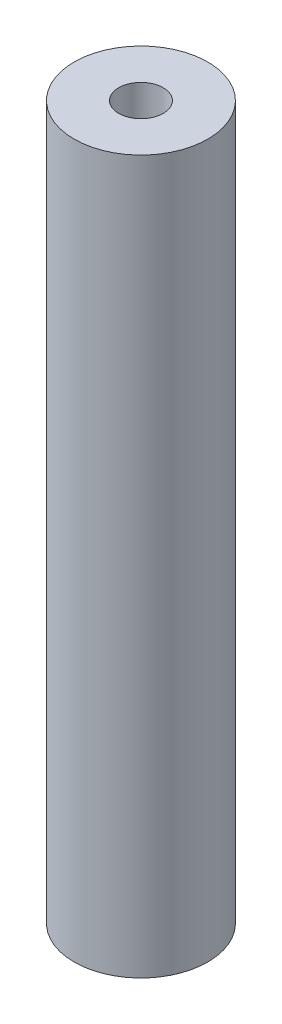
ISO-10303-21;
HEADER;
FILE_DESCRIPTION(('STEP AP214'),'2;1');
FILE_NAME('part.step','',(''),(''),'','','');
FILE_SCHEMA(('AUTOMOTIVE_DESIGN { 1 0 10303 214 1 1 1 1 }'));
ENDSEC;
DATA;
#1=APPLICATION_CONTEXT('core data for automotive mechanical design processes');
#2=APPLICATION_PROTOCOL_DEFINITION('international standard','automotive_design',2000,#1);
#3=PRODUCT_CONTEXT('',#1,'mechanical');
#4=PRODUCT('Part','Part','',(#3));
#5=PRODUCT_RELATED_PRODUCT_CATEGORY('part','',(#4));
#6=PRODUCT_DEFINITION_FORMATION('','',#4);
#7=PRODUCT_DEFINITION_CONTEXT('part definition',#1,'design');
#8=PRODUCT_DEFINITION('design','',#6,#7);
#9=PRODUCT_DEFINITION_SHAPE('','',#8);
#10=(LENGTH_UNIT() NAMED_UNIT(*) SI_UNIT(.MILLI.,.METRE.));
#11=(NAMED_UNIT(*) PLANE_ANGLE_UNIT() SI_UNIT($,.RADIAN.));
#12=(NAMED_UNIT(*) SI_UNIT($,.STERADIAN.) SOLID_ANGLE_UNIT());
#13=UNCERTAINTY_MEASURE_WITH_UNIT(LENGTH_MEASURE(1.E-05),#10,'distance_accuracy_value','');
#14=(GEOMETRIC_REPRESENTATION_CONTEXT(3) GLOBAL_UNCERTAINTY_ASSIGNED_CONTEXT((#13)) GLOBAL_UNIT_ASSIGNED_CONTEXT((#10,
#11,#12)) REPRESENTATION_CONTEXT('',''));
#15=CARTESIAN_POINT('',(0.,0.,0.));
#16=DIRECTION('',(0.,0.,1.));
#17=DIRECTION('',(1.,0.,0.));
#18=AXIS2_PLACEMENT_3D('',#15,#16,#17);
#19=CARTESIAN_POINT('',(0.,80.,0.));
#20=DIRECTION('',(0.,1.,0.));
#21=DIRECTION('',(0.,0.,1.));
#22=AXIS2_PLACEMENT_3D('',#19,#20,#21);
#23=PLANE('',#22);
#24=CARTESIAN_POINT('',(0.,80.,0.));
#25=DIRECTION('',(0.,1.,0.));
#26=DIRECTION('',(0.,0.,1.));
#27=AXIS2_PLACEMENT_3D('',#24,#25,#26);
#28=CIRCLE('',#27,7.5);
#29=CARTESIAN_POINT('',(0.,80.,7.5));
#30=VERTEX_POINT('',#29);
#31=EDGE_CURVE('E10',#30,#30,#28,.T.);
#32=ORIENTED_EDGE('',*,*,#31,.T.);
#33=EDGE_LOOP('',(#32));
#34=FACE_BOUND('',#33,.T.);
#35=CARTESIAN_POINT('',(0.,80.,0.));
#36=DIRECTION('',(0.,1.,0.));
#37=DIRECTION('',(0.,0.,1.));
#38=AXIS2_PLACEMENT_3D('',#35,#36,#37);
#39=CIRCLE('',#38,2.5);
#40=CARTESIAN_POINT('',(0.,80.,2.5));
#41=VERTEX_POINT('',#40);
#42=EDGE_CURVE('E43',#41,#41,#39,.T.);
#43=ORIENTED_EDGE('',*,*,#42,.F.);
#44=EDGE_LOOP('',(#43));
#45=FACE_BOUND('',#44,.T.);
#46=ADVANCED_FACE('F32',(#34,#45),#23,.T.);
#47=CARTESIAN_POINT('',(0.,0.,0.));
#48=DIRECTION('',(0.,1.,0.));
#49=DIRECTION('',(0.,0.,1.));
#50=AXIS2_PLACEMENT_3D('',#47,#48,#49);
#51=PLANE('',#50);
#52=CARTESIAN_POINT('',(0.,0.,0.));
#53=DIRECTION('',(0.,1.,0.));
#54=DIRECTION('',(0.,0.,1.));
#55=AXIS2_PLACEMENT_3D('',#52,#53,#54);
#56=CIRCLE('',#55,7.5);
#57=CARTESIAN_POINT('',(0.,0.,7.5));
#58=VERTEX_POINT('',#57);
#59=EDGE_CURVE('E36',#58,#58,#56,.T.);
#60=ORIENTED_EDGE('',*,*,#59,.F.);
#61=EDGE_LOOP('',(#60));
#62=FACE_BOUND('',#61,.T.);
#63=CARTESIAN_POINT('',(0.,0.,0.));
#64=DIRECTION('',(0.,1.,0.));
#65=DIRECTION('',(0.,0.,1.));
#66=AXIS2_PLACEMENT_3D('',#63,#64,#65);
#67=CIRCLE('',#66,2.5);
#68=CARTESIAN_POINT('',(0.,0.,2.5));
#69=VERTEX_POINT('',#68);
#70=EDGE_CURVE('E45',#69,#69,#67,.T.);
#71=ORIENTED_EDGE('',*,*,#70,.T.);
#72=EDGE_LOOP('',(#71));
#73=FACE_BOUND('',#72,.T.);
#74=ADVANCED_FACE('F55',(#62,#73),#51,.F.);
#75=CARTESIAN_POINT('',(0.,80.,0.));
#76=DIRECTION('',(0.,-1.,0.));
#77=DIRECTION('',(0.,0.,-1.));
#78=AXIS2_PLACEMENT_3D('',#75,#76,#77);
#79=CYLINDRICAL_SURFACE('',#78,7.5);
#80=ORIENTED_EDGE('',*,*,#31,.F.);
#81=EDGE_LOOP('',(#80));
#82=FACE_BOUND('',#81,.T.);
#83=ORIENTED_EDGE('',*,*,#59,.T.);
#84=EDGE_LOOP('',(#83));
#85=FACE_BOUND('',#84,.T.);
#86=ADVANCED_FACE('F34',(#82,#85),#79,.T.);
#87=CARTESIAN_POINT('',(0.,80.,0.));
#88=DIRECTION('',(0.,-1.,0.));
#89=DIRECTION('',(0.,0.,-1.));
#90=AXIS2_PLACEMENT_3D('',#87,#88,#89);
#91=CYLINDRICAL_SURFACE('',#90,2.5);
#92=ORIENTED_EDGE('',*,*,#42,.T.);
#93=EDGE_LOOP('',(#92));
#94=FACE_BOUND('',#93,.T.);
#95=ORIENTED_EDGE('',*,*,#70,.F.);
#96=EDGE_LOOP('',(#95));
#97=FACE_BOUND('',#96,.T.);
#98=ADVANCED_FACE('F51',(#94,#97),#91,.F.);
#99=CLOSED_SHELL('',(#46,#74,#86,#98));
#100=MANIFOLD_SOLID_BREP('B2',#99);
#101=ADVANCED_BREP_SHAPE_REPRESENTATION('',(#18,#100),#14);
#102=SHAPE_DEFINITION_REPRESENTATION(#9,#101);
ENDSEC;
END-ISO-10303-21;
